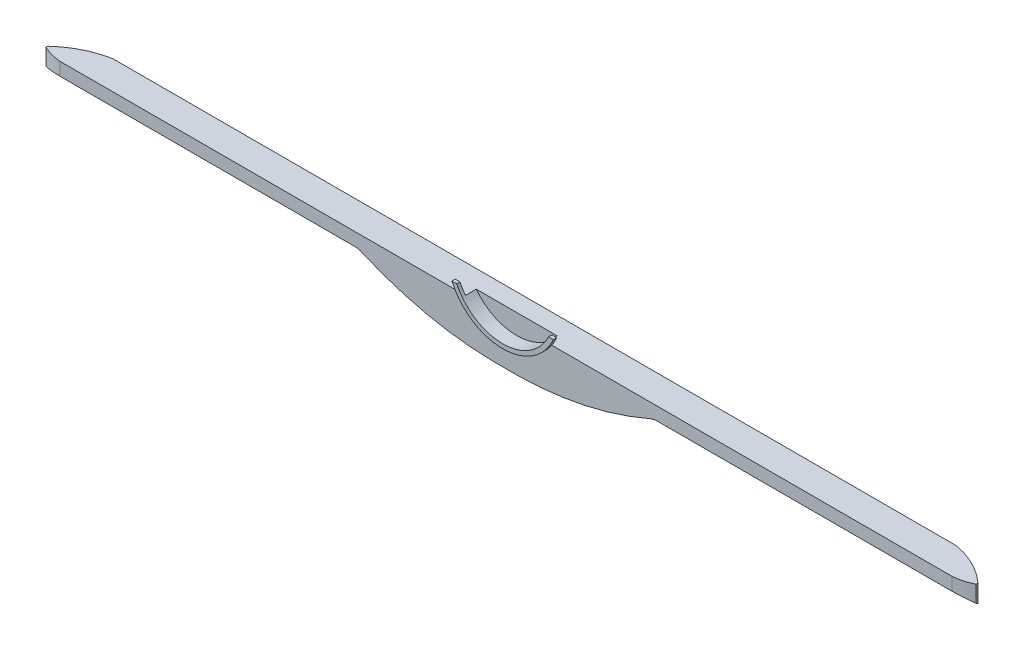
ISO-10303-21;
HEADER;
FILE_DESCRIPTION(('STEP AP214'),'2;1');
FILE_NAME('part.step','',(''),(''),'','','');
FILE_SCHEMA(('AUTOMOTIVE_DESIGN { 1 0 10303 214 1 1 1 1 }'));
ENDSEC;
DATA;
#1=APPLICATION_CONTEXT('core data for automotive mechanical design processes');
#2=APPLICATION_PROTOCOL_DEFINITION('international standard','automotive_design',2000,#1);
#3=PRODUCT_CONTEXT('',#1,'mechanical');
#4=PRODUCT('Part','Part','',(#3));
#5=PRODUCT_RELATED_PRODUCT_CATEGORY('part','',(#4));
#6=PRODUCT_DEFINITION_FORMATION('','',#4);
#7=PRODUCT_DEFINITION_CONTEXT('part definition',#1,'design');
#8=PRODUCT_DEFINITION('design','',#6,#7);
#9=PRODUCT_DEFINITION_SHAPE('','',#8);
#10=(LENGTH_UNIT() NAMED_UNIT(*) SI_UNIT(.MILLI.,.METRE.));
#11=(NAMED_UNIT(*) PLANE_ANGLE_UNIT() SI_UNIT($,.RADIAN.));
#12=(NAMED_UNIT(*) SI_UNIT($,.STERADIAN.) SOLID_ANGLE_UNIT());
#13=UNCERTAINTY_MEASURE_WITH_UNIT(LENGTH_MEASURE(1.E-05),#10,'distance_accuracy_value','');
#14=(GEOMETRIC_REPRESENTATION_CONTEXT(3) GLOBAL_UNCERTAINTY_ASSIGNED_CONTEXT((#13)) GLOBAL_UNIT_ASSIGNED_CONTEXT((#10,
#11,#12)) REPRESENTATION_CONTEXT('',''));
#15=CARTESIAN_POINT('',(0.,0.,0.));
#16=DIRECTION('',(0.,0.,1.));
#17=DIRECTION('',(1.,0.,0.));
#18=AXIS2_PLACEMENT_3D('',#15,#16,#17);
#19=CARTESIAN_POINT('',(0.,43.5677984931941,3.93521612422814));
#20=DIRECTION('',(0.,0.,1.));
#21=DIRECTION('',(1.,0.,0.));
#22=AXIS2_PLACEMENT_3D('',#19,#20,#21);
#23=PLANE('',#22);
#24=DIRECTION('',(1.,0.,0.));
#25=VECTOR('',#24,1.);
#26=CARTESIAN_POINT('',(26.9786256199849,30.6561762367186,3.93521612422814));
#27=LINE('',#26,#25);
#28=CARTESIAN_POINT('',(26.9786256199849,30.6561762367186,3.93521612422814));
#29=VERTEX_POINT('',#28);
#30=CARTESIAN_POINT('',(29.7697201090978,30.6561762367186,3.93521612422814));
#31=VERTEX_POINT('',#30);
#32=EDGE_CURVE('E156',#29,#31,#27,.T.);
#33=ORIENTED_EDGE('',*,*,#32,.F.);
#34=CARTESIAN_POINT('',(0.,43.5677984931941,3.93521612422814));
#35=DIRECTION('',(0.,0.,-1.));
#36=DIRECTION('',(-1.,0.,0.));
#37=AXIS2_PLACEMENT_3D('',#34,#35,#36);
#38=CIRCLE('',#37,29.9091328800622);
#39=CARTESIAN_POINT('',(-26.9786256199849,30.6561762367186,3.93521612422814));
#40=VERTEX_POINT('',#39);
#41=EDGE_CURVE('E166',#29,#40,#38,.T.);
#42=ORIENTED_EDGE('',*,*,#41,.T.);
#43=DIRECTION('',(1.,0.,0.));
#44=VECTOR('',#43,1.);
#45=CARTESIAN_POINT('',(-29.7697201090978,30.6561762367186,3.93521612422814));
#46=LINE('',#45,#44);
#47=CARTESIAN_POINT('',(-29.7697201090978,30.6561762367186,3.93521612422814));
#48=VERTEX_POINT('',#47);
#49=EDGE_CURVE('E161',#48,#40,#46,.T.);
#50=ORIENTED_EDGE('',*,*,#49,.F.);
#51=CARTESIAN_POINT('',(0.,43.5677984931941,3.93521612422814));
#52=DIRECTION('',(0.,0.,-1.));
#53=DIRECTION('',(-1.,0.,0.));
#54=AXIS2_PLACEMENT_3D('',#51,#52,#53);
#55=CIRCLE('',#54,32.4491328800622);
#56=EDGE_CURVE('E20',#31,#48,#55,.T.);
#57=ORIENTED_EDGE('',*,*,#56,.F.);
#58=EDGE_LOOP('',(#33,#42,#50,#57));
#59=FACE_BOUND('',#58,.T.);
#60=ADVANCED_FACE('F17',(#59),#23,.T.);
#61=CARTESIAN_POINT('',(26.9786256199849,30.6561762367186,3.93521612422814));
#62=DIRECTION('',(0.,1.,0.));
#63=DIRECTION('',(0.,0.,1.));
#64=AXIS2_PLACEMENT_3D('',#61,#62,#63);
#65=PLANE('',#64);
#66=ORIENTED_EDGE('',*,*,#32,.T.);
#67=DIRECTION('',(0.,0.,-1.));
#68=VECTOR('',#67,1.);
#69=CARTESIAN_POINT('',(29.7697201090978,30.6561762367186,3.93521612422814));
#70=LINE('',#69,#68);
#71=CARTESIAN_POINT('',(29.7697201090978,30.6561762367186,2.03021612422814));
#72=VERTEX_POINT('',#71);
#73=EDGE_CURVE('E169',#72,#31,#70,.F.);
#74=ORIENTED_EDGE('',*,*,#73,.F.);
#75=DIRECTION('',(1.,0.,0.));
#76=VECTOR('',#75,1.);
#77=CARTESIAN_POINT('',(0.,30.6561762367186,2.03021612422814));
#78=LINE('',#77,#76);
#79=CARTESIAN_POINT('',(26.9786256199849,30.6561762367186,2.03021612422814));
#80=VERTEX_POINT('',#79);
#81=EDGE_CURVE('E264',#72,#80,#78,.F.);
#82=ORIENTED_EDGE('',*,*,#81,.T.);
#83=DIRECTION('',(0.,0.,-1.));
#84=VECTOR('',#83,1.);
#85=CARTESIAN_POINT('',(26.9786256199849,30.6561762367186,3.93521612422814));
#86=LINE('',#85,#84);
#87=EDGE_CURVE('E184',#80,#29,#86,.F.);
#88=ORIENTED_EDGE('',*,*,#87,.T.);
#89=EDGE_LOOP('',(#66,#74,#82,#88));
#90=FACE_BOUND('',#89,.T.);
#91=ADVANCED_FACE('F404',(#90),#65,.T.);
#92=CARTESIAN_POINT('',(-29.7697201090978,30.6561762367186,3.93521612422814));
#93=DIRECTION('',(0.,1.,0.));
#94=DIRECTION('',(0.,0.,1.));
#95=AXIS2_PLACEMENT_3D('',#92,#93,#94);
#96=PLANE('',#95);
#97=ORIENTED_EDGE('',*,*,#49,.T.);
#98=DIRECTION('',(0.,0.,-1.));
#99=VECTOR('',#98,1.);
#100=CARTESIAN_POINT('',(-26.9786256199849,30.6561762367186,3.93521612422814));
#101=LINE('',#100,#99);
#102=CARTESIAN_POINT('',(-26.9786256199849,30.6561762367186,2.03021612422814));
#103=VERTEX_POINT('',#102);
#104=EDGE_CURVE('E267',#40,#103,#101,.T.);
#105=ORIENTED_EDGE('',*,*,#104,.T.);
#106=DIRECTION('',(1.,0.,0.));
#107=VECTOR('',#106,1.);
#108=CARTESIAN_POINT('',(0.,30.6561762367186,2.03021612422814));
#109=LINE('',#108,#107);
#110=CARTESIAN_POINT('',(-29.7697201090978,30.6561762367186,2.03021612422814));
#111=VERTEX_POINT('',#110);
#112=EDGE_CURVE('E175',#103,#111,#109,.F.);
#113=ORIENTED_EDGE('',*,*,#112,.T.);
#114=DIRECTION('',(0.,0.,-1.));
#115=VECTOR('',#114,1.);
#116=CARTESIAN_POINT('',(-29.7697201090978,30.6561762367186,3.93521612422814));
#117=LINE('',#116,#115);
#118=EDGE_CURVE('E172',#48,#111,#117,.T.);
#119=ORIENTED_EDGE('',*,*,#118,.F.);
#120=EDGE_LOOP('',(#97,#105,#113,#119));
#121=FACE_BOUND('',#120,.T.);
#122=ADVANCED_FACE('F173',(#121),#96,.T.);
#123=CARTESIAN_POINT('',(0.,43.5677984931941,3.93521612422814));
#124=DIRECTION('',(0.,0.,-1.));
#125=DIRECTION('',(-1.,0.,0.));
#126=AXIS2_PLACEMENT_3D('',#123,#124,#125);
#127=CYLINDRICAL_SURFACE('',#126,32.4491328800622);
#128=ORIENTED_EDGE('',*,*,#56,.T.);
#129=ORIENTED_EDGE('',*,*,#118,.T.);
#130=CARTESIAN_POINT('',(0.,43.5677984931941,2.03021612422814));
#131=DIRECTION('',(0.,0.,-1.));
#132=DIRECTION('',(-1.,0.,0.));
#133=AXIS2_PLACEMENT_3D('',#130,#131,#132);
#134=CIRCLE('',#133,32.4491328800622);
#135=CARTESIAN_POINT('',(-26.8863780115252,25.4,2.03021612422814));
#136=VERTEX_POINT('',#135);
#137=EDGE_CURVE('E255',#111,#136,#134,.F.);
#138=ORIENTED_EDGE('',*,*,#137,.T.);
#139=CARTESIAN_POINT('',(0.,43.5677984931941,2.03021612422814));
#140=DIRECTION('',(0.,0.,-1.));
#141=DIRECTION('',(-1.,0.,0.));
#142=AXIS2_PLACEMENT_3D('',#139,#140,#141);
#143=CIRCLE('',#142,32.4491328800622);
#144=CARTESIAN_POINT('',(26.8863780115252,25.4,2.03021612422814));
#145=VERTEX_POINT('',#144);
#146=EDGE_CURVE('E243',#136,#145,#143,.F.);
#147=ORIENTED_EDGE('',*,*,#146,.T.);
#148=CARTESIAN_POINT('',(0.,43.5677984931941,2.03021612422814));
#149=DIRECTION('',(0.,0.,-1.));
#150=DIRECTION('',(-1.,0.,0.));
#151=AXIS2_PLACEMENT_3D('',#148,#149,#150);
#152=CIRCLE('',#151,32.4491328800622);
#153=EDGE_CURVE('E265',#145,#72,#152,.F.);
#154=ORIENTED_EDGE('',*,*,#153,.T.);
#155=ORIENTED_EDGE('',*,*,#73,.T.);
#156=EDGE_LOOP('',(#128,#129,#138,#147,#154,#155));
#157=FACE_BOUND('',#156,.T.);
#158=ADVANCED_FACE('F180',(#157),#127,.T.);
#159=CARTESIAN_POINT('',(-88.9,7.34663165308634,9.27140559403347));
#160=DIRECTION('',(0.,-0.570172399197273,-0.821525066686115));
#161=DIRECTION('',(0.,0.821525066686115,-0.570172399197273));
#162=AXIS2_PLACEMENT_3D('',#159,#160,#161);
#163=CYLINDRICAL_SURFACE('',#162,12.7);
#164=CARTESIAN_POINT('',(-88.9,6.08756605075157,7.45729822163786));
#165=DIRECTION('',(-0.928883399168645,0.370372286691247,0.));
#166=DIRECTION('',(-0.200683743541891,-0.503309250064055,-0.840479526150383));
#167=AXIS2_PLACEMENT_3D('',#164,#165,#166);
#168=ELLIPSE('',#167,60.1393940332044,12.7);
#169=CARTESIAN_POINT('',(-88.9000000000002,6.08756605075219,-14.8166666666651));
#170=VERTEX_POINT('',#169);
#171=CARTESIAN_POINT('',(-84.6016667576282,16.8676663347188,2.03021612422814));
#172=VERTEX_POINT('',#171);
#173=EDGE_CURVE('E232',#170,#172,#168,.F.);
#174=ORIENTED_EDGE('',*,*,#173,.T.);
#175=CARTESIAN_POINT('',(-88.9,2.3209464482569,2.03021612422815));
#176=DIRECTION('',(0.,0.,-1.));
#177=DIRECTION('',(0.,-1.,0.));
#178=AXIS2_PLACEMENT_3D('',#175,#176,#177);
#179=ELLIPSE('',#178,15.4590535517431,12.7);
#180=CARTESIAN_POINT('',(-88.8999999999999,17.78,2.03021612422815));
#181=VERTEX_POINT('',#180);
#182=EDGE_CURVE('E246',#172,#181,#179,.F.);
#183=ORIENTED_EDGE('',*,*,#182,.T.);
#184=DIRECTION('',(0.,0.570172399197273,0.821525066686115));
#185=VECTOR('',#184,1.);
#186=CARTESIAN_POINT('',(-88.8999999999997,17.78,2.03021612422811));
#187=LINE('',#186,#185);
#188=EDGE_CURVE('E227',#181,#170,#187,.F.);
#189=ORIENTED_EDGE('',*,*,#188,.T.);
#190=EDGE_LOOP('',(#174,#183,#189));
#191=FACE_BOUND('',#190,.T.);
#192=ADVANCED_FACE('F318',(#191),#163,.F.);
#193=CARTESIAN_POINT('',(-273.05,25.4,-6.39322527121921));
#194=DIRECTION('',(-1.,0.,0.));
#195=DIRECTION('',(0.,0.,1.));
#196=AXIS2_PLACEMENT_3D('',#193,#194,#195);
#197=PLANE('',#196);
#198=DIRECTION('',(0.,0.,1.));
#199=VECTOR('',#198,1.);
#200=CARTESIAN_POINT('',(-273.05,25.4,-6.39322527121921));
#201=LINE('',#200,#199);
#202=CARTESIAN_POINT('',(-273.05,25.4,-0.973666666666666));
#203=VERTEX_POINT('',#202);
#204=CARTESIAN_POINT('',(-273.05,25.4,-2.11666666666667));
#205=VERTEX_POINT('',#204);
#206=EDGE_CURVE('E178',#203,#205,#201,.F.);
#207=ORIENTED_EDGE('',*,*,#206,.T.);
#208=DIRECTION('',(0.,-1.,0.));
#209=VECTOR('',#208,1.);
#210=CARTESIAN_POINT('',(-273.05,25.4,-2.11666666666667));
#211=LINE('',#210,#209);
#212=CARTESIAN_POINT('',(-273.05,14.9018917036675,-2.11666666666677));
#213=VERTEX_POINT('',#212);
#214=EDGE_CURVE('E226',#213,#205,#211,.F.);
#215=ORIENTED_EDGE('',*,*,#214,.F.);
#216=DIRECTION('',(0.,0.570172399197273,0.821525066686115));
#217=VECTOR('',#216,1.);
#218=CARTESIAN_POINT('',(-273.05,17.78,2.03021612422811));
#219=LINE('',#218,#217);
#220=CARTESIAN_POINT('',(-273.05,15.6951810124301,-0.973666666666617));
#221=VERTEX_POINT('',#220);
#222=EDGE_CURVE('E231',#213,#221,#219,.T.);
#223=ORIENTED_EDGE('',*,*,#222,.T.);
#224=DIRECTION('',(0.,-1.,0.));
#225=VECTOR('',#224,1.);
#226=CARTESIAN_POINT('',(-273.05,25.4,-0.973666666666664));
#227=LINE('',#226,#225);
#228=EDGE_CURVE('E261',#203,#221,#227,.T.);
#229=ORIENTED_EDGE('',*,*,#228,.F.);
#230=EDGE_LOOP('',(#207,#215,#223,#229));
#231=FACE_BOUND('',#230,.T.);
#232=ADVANCED_FACE('F309',(#231),#197,.T.);
#233=CARTESIAN_POINT('',(0.,-395.337646810208,-4.31978387577186));
#234=DIRECTION('',(0.,0.,1.));
#235=DIRECTION('',(1.,0.,0.));
#236=AXIS2_PLACEMENT_3D('',#233,#234,#235);
#237=PLANE('',#236);
#238=DIRECTION('',(1.,0.,0.));
#239=VECTOR('',#238,1.);
#240=CARTESIAN_POINT('',(-425.109610298846,25.4,-4.31978387577186));
#241=LINE('',#240,#239);
#242=CARTESIAN_POINT('',(-23.7589420544752,25.4,-4.31978387577186));
#243=VERTEX_POINT('',#242);
#244=CARTESIAN_POINT('',(23.7589420544752,25.4,-4.31978387577186));
#245=VERTEX_POINT('',#244);
#246=EDGE_CURVE('E278',#243,#245,#241,.T.);
#247=ORIENTED_EDGE('',*,*,#246,.F.);
#248=CARTESIAN_POINT('',(0.,43.5677984931941,-4.31978387577186));
#249=DIRECTION('',(0.,0.,-1.));
#250=DIRECTION('',(-1.,0.,0.));
#251=AXIS2_PLACEMENT_3D('',#248,#249,#250);
#252=CIRCLE('',#251,29.9091328800622);
#253=EDGE_CURVE('E268',#243,#245,#252,.F.);
#254=ORIENTED_EDGE('',*,*,#253,.T.);
#255=EDGE_LOOP('',(#247,#254));
#256=FACE_BOUND('',#255,.T.);
#257=ADVANCED_FACE('F307',(#256),#237,.T.);
#258=CARTESIAN_POINT('',(0.,43.5677984931941,3.93521612422814));
#259=DIRECTION('',(0.,0.,-1.));
#260=DIRECTION('',(-1.,0.,0.));
#261=AXIS2_PLACEMENT_3D('',#258,#259,#260);
#262=CYLINDRICAL_SURFACE('',#261,29.9091328800622);
#263=ORIENTED_EDGE('',*,*,#104,.F.);
#264=ORIENTED_EDGE('',*,*,#41,.F.);
#265=ORIENTED_EDGE('',*,*,#87,.F.);
#266=CARTESIAN_POINT('',(0.,43.5677984931941,2.03021612422814));
#267=DIRECTION('',(0.,0.,-1.));
#268=DIRECTION('',(-1.,0.,0.));
#269=AXIS2_PLACEMENT_3D('',#266,#267,#268);
#270=CIRCLE('',#269,29.9091328800622);
#271=CARTESIAN_POINT('',(23.7589420544752,25.4,2.03021612422814));
#272=VERTEX_POINT('',#271);
#273=EDGE_CURVE('E262',#80,#272,#270,.T.);
#274=ORIENTED_EDGE('',*,*,#273,.T.);
#275=DIRECTION('',(0.,0.,1.));
#276=VECTOR('',#275,1.);
#277=CARTESIAN_POINT('',(23.7589420544752,25.4,-6.39322527121921));
#278=LINE('',#277,#276);
#279=EDGE_CURVE('E301',#245,#272,#278,.T.);
#280=ORIENTED_EDGE('',*,*,#279,.F.);
#281=ORIENTED_EDGE('',*,*,#253,.F.);
#282=DIRECTION('',(0.,0.,1.));
#283=VECTOR('',#282,1.);
#284=CARTESIAN_POINT('',(-23.7589420544752,25.4,-6.39322527121921));
#285=LINE('',#284,#283);
#286=CARTESIAN_POINT('',(-23.7589420544752,25.4,2.03021612422814));
#287=VERTEX_POINT('',#286);
#288=EDGE_CURVE('E284',#287,#243,#285,.F.);
#289=ORIENTED_EDGE('',*,*,#288,.F.);
#290=CARTESIAN_POINT('',(0.,43.5677984931941,2.03021612422814));
#291=DIRECTION('',(0.,0.,-1.));
#292=DIRECTION('',(-1.,0.,0.));
#293=AXIS2_PLACEMENT_3D('',#290,#291,#292);
#294=CIRCLE('',#293,29.9091328800622);
#295=EDGE_CURVE('E258',#287,#103,#294,.T.);
#296=ORIENTED_EDGE('',*,*,#295,.T.);
#297=EDGE_LOOP('',(#263,#264,#265,#274,#280,#281,#289,#296));
#298=FACE_BOUND('',#297,.T.);
#299=ADVANCED_FACE('F282',(#298),#262,.F.);
#300=CARTESIAN_POINT('',(0.,43.5677984931941,2.03021612422814));
#301=DIRECTION('',(0.,0.,1.));
#302=DIRECTION('',(1.,0.,0.));
#303=AXIS2_PLACEMENT_3D('',#300,#301,#302);
#304=PLANE('',#303);
#305=ORIENTED_EDGE('',*,*,#273,.F.);
#306=ORIENTED_EDGE('',*,*,#81,.F.);
#307=ORIENTED_EDGE('',*,*,#153,.F.);
#308=DIRECTION('',(1.,0.,0.));
#309=VECTOR('',#308,1.);
#310=CARTESIAN_POINT('',(-425.109610298846,25.4,2.03021612422814));
#311=LINE('',#310,#309);
#312=EDGE_CURVE('E298',#272,#145,#311,.T.);
#313=ORIENTED_EDGE('',*,*,#312,.F.);
#314=EDGE_LOOP('',(#305,#306,#307,#313));
#315=FACE_BOUND('',#314,.T.);
#316=ADVANCED_FACE('F316',(#315),#304,.F.);
#317=CARTESIAN_POINT('',(-259.353959890382,25.4,-29.6177059299364));
#318=DIRECTION('',(0.,-1.,0.));
#319=DIRECTION('',(0.,0.,-1.));
#320=AXIS2_PLACEMENT_3D('',#317,#318,#319);
#321=CYLINDRICAL_SURFACE('',#320,31.75);
#322=DIRECTION('',(0.,1.,0.));
#323=VECTOR('',#322,1.);
#324=CARTESIAN_POINT('',(-261.897880025434,25.4,2.03021612422817));
#325=LINE('',#324,#323);
#326=CARTESIAN_POINT('',(-261.897880025434,17.78,2.03021612422812));
#327=VERTEX_POINT('',#326);
#328=CARTESIAN_POINT('',(-261.897880025434,25.4,2.03021612422817));
#329=VERTEX_POINT('',#328);
#330=EDGE_CURVE('E245',#327,#329,#325,.T.);
#331=ORIENTED_EDGE('',*,*,#330,.T.);
#332=CARTESIAN_POINT('',(-259.353959890382,25.4,-29.6177059299364));
#333=DIRECTION('',(0.,-1.,0.));
#334=DIRECTION('',(0.,0.,-1.));
#335=AXIS2_PLACEMENT_3D('',#332,#333,#334);
#336=CIRCLE('',#335,31.75);
#337=EDGE_CURVE('E211',#203,#329,#336,.F.);
#338=ORIENTED_EDGE('',*,*,#337,.F.);
#339=ORIENTED_EDGE('',*,*,#228,.T.);
#340=CARTESIAN_POINT('',(-259.353959890382,-4.18496781287591,-29.6177059299364));
#341=DIRECTION('',(0.,0.821525066686115,-0.570172399197273));
#342=DIRECTION('',(0.,-0.570172399197273,-0.821525066686115));
#343=AXIS2_PLACEMENT_3D('',#340,#341,#342);
#344=ELLIPSE('',#343,38.6476338793578,31.75);
#345=EDGE_CURVE('E228',#221,#327,#344,.T.);
#346=ORIENTED_EDGE('',*,*,#345,.T.);
#347=EDGE_LOOP('',(#331,#338,#339,#346));
#348=FACE_BOUND('',#347,.T.);
#349=ADVANCED_FACE('F391',(#348),#321,.T.);
#350=CARTESIAN_POINT('',(0.,43.5677984931941,2.03021612422814));
#351=DIRECTION('',(0.,0.,1.));
#352=DIRECTION('',(1.,0.,0.));
#353=AXIS2_PLACEMENT_3D('',#350,#351,#352);
#354=PLANE('',#353);
#355=ORIENTED_EDGE('',*,*,#137,.F.);
#356=ORIENTED_EDGE('',*,*,#112,.F.);
#357=ORIENTED_EDGE('',*,*,#295,.F.);
#358=DIRECTION('',(1.,0.,0.));
#359=VECTOR('',#358,1.);
#360=CARTESIAN_POINT('',(-425.109610298846,25.4,2.03021612422814));
#361=LINE('',#360,#359);
#362=EDGE_CURVE('E210',#136,#287,#361,.T.);
#363=ORIENTED_EDGE('',*,*,#362,.F.);
#364=EDGE_LOOP('',(#355,#356,#357,#363));
#365=FACE_BOUND('',#364,.T.);
#366=ADVANCED_FACE('F288',(#365),#354,.F.);
#367=CARTESIAN_POINT('',(273.05,25.4,-6.39322527121921));
#368=DIRECTION('',(-1.,0.,0.));
#369=DIRECTION('',(0.,0.,1.));
#370=AXIS2_PLACEMENT_3D('',#367,#368,#369);
#371=PLANE('',#370);
#372=DIRECTION('',(0.,-1.,0.));
#373=VECTOR('',#372,1.);
#374=CARTESIAN_POINT('',(273.05,25.4,-2.11666666666675));
#375=LINE('',#374,#373);
#376=CARTESIAN_POINT('',(273.05,25.4,-2.11666666666679));
#377=VERTEX_POINT('',#376);
#378=CARTESIAN_POINT('',(273.05,14.9018917036675,-2.1166666666668));
#379=VERTEX_POINT('',#378);
#380=EDGE_CURVE('E209',#377,#379,#375,.T.);
#381=ORIENTED_EDGE('',*,*,#380,.F.);
#382=DIRECTION('',(0.,0.,1.));
#383=VECTOR('',#382,1.);
#384=CARTESIAN_POINT('',(273.05,25.4,-6.39322527121921));
#385=LINE('',#384,#383);
#386=CARTESIAN_POINT('',(273.05,25.4,-0.973666666666697));
#387=VERTEX_POINT('',#386);
#388=EDGE_CURVE('E218',#387,#377,#385,.F.);
#389=ORIENTED_EDGE('',*,*,#388,.F.);
#390=DIRECTION('',(0.,-1.,0.));
#391=VECTOR('',#390,1.);
#392=CARTESIAN_POINT('',(273.05,25.4,-0.973666666666699));
#393=LINE('',#392,#391);
#394=CARTESIAN_POINT('',(273.05,15.69518101243,-0.973666666666694));
#395=VERTEX_POINT('',#394);
#396=EDGE_CURVE('E254',#395,#387,#393,.F.);
#397=ORIENTED_EDGE('',*,*,#396,.F.);
#398=DIRECTION('',(0.,0.570172399197275,0.821525066686113));
#399=VECTOR('',#398,1.);
#400=CARTESIAN_POINT('',(273.05,14.9018917036676,-2.11666666666667));
#401=LINE('',#400,#399);
#402=EDGE_CURVE('E257',#379,#395,#401,.T.);
#403=ORIENTED_EDGE('',*,*,#402,.F.);
#404=EDGE_LOOP('',(#381,#389,#397,#403));
#405=FACE_BOUND('',#404,.T.);
#406=ADVANCED_FACE('F384',(#405),#371,.F.);
#407=CARTESIAN_POINT('',(88.9,1.56641473082901,0.943059467137366));
#408=DIRECTION('',(0.,0.570172399197273,0.821525066686115));
#409=DIRECTION('',(0.,-0.821525066686115,0.570172399197273));
#410=AXIS2_PLACEMENT_3D('',#407,#408,#409);
#411=CYLINDRICAL_SURFACE('',#410,12.7);
#412=DIRECTION('',(0.,-0.570172399197273,-0.821525066686115));
#413=VECTOR('',#412,1.);
#414=CARTESIAN_POINT('',(88.8999999999997,17.78,2.03021612422811));
#415=LINE('',#414,#413);
#416=CARTESIAN_POINT('',(88.8999999999998,17.78,2.03021612422812));
#417=VERTEX_POINT('',#416);
#418=CARTESIAN_POINT('',(88.8999999999997,6.0875660507516,-14.8166666666659));
#419=VERTEX_POINT('',#418);
#420=EDGE_CURVE('E205',#417,#419,#415,.T.);
#421=ORIENTED_EDGE('',*,*,#420,.F.);
#422=CARTESIAN_POINT('',(88.9,2.32094644825689,2.03021612422813));
#423=DIRECTION('',(0.,0.,-1.));
#424=DIRECTION('',(0.,1.,0.));
#425=AXIS2_PLACEMENT_3D('',#422,#423,#424);
#426=ELLIPSE('',#425,15.4590535517431,12.7);
#427=CARTESIAN_POINT('',(84.6016667576282,16.8676663347185,2.03021612422813));
#428=VERTEX_POINT('',#427);
#429=EDGE_CURVE('E248',#417,#428,#426,.F.);
#430=ORIENTED_EDGE('',*,*,#429,.T.);
#431=CARTESIAN_POINT('',(88.9,6.08756605075151,7.45729822163778));
#432=DIRECTION('',(-0.928883399168645,-0.370372286691247,0.));
#433=DIRECTION('',(-0.200683743541891,0.503309250064055,0.840479526150383));
#434=AXIS2_PLACEMENT_3D('',#431,#432,#433);
#435=ELLIPSE('',#434,60.1393940332044,12.7);
#436=EDGE_CURVE('E251',#419,#428,#435,.F.);
#437=ORIENTED_EDGE('',*,*,#436,.F.);
#438=EDGE_LOOP('',(#421,#430,#437));
#439=FACE_BOUND('',#438,.T.);
#440=ADVANCED_FACE('F380',(#439),#411,.F.);
#441=CARTESIAN_POINT('',(259.353959890382,25.4,-29.6177059299364));
#442=DIRECTION('',(0.,-1.,0.));
#443=DIRECTION('',(0.,0.,-1.));
#444=AXIS2_PLACEMENT_3D('',#441,#442,#443);
#445=CYLINDRICAL_SURFACE('',#444,31.75);
#446=ORIENTED_EDGE('',*,*,#396,.T.);
#447=CARTESIAN_POINT('',(259.353959890382,25.4,-29.6177059299364));
#448=DIRECTION('',(0.,-1.,0.));
#449=DIRECTION('',(0.,0.,-1.));
#450=AXIS2_PLACEMENT_3D('',#447,#448,#449);
#451=CIRCLE('',#450,31.75);
#452=CARTESIAN_POINT('',(261.897880025434,25.4,2.03021612422813));
#453=VERTEX_POINT('',#452);
#454=EDGE_CURVE('E219',#453,#387,#451,.F.);
#455=ORIENTED_EDGE('',*,*,#454,.F.);
#456=DIRECTION('',(0.,1.,0.));
#457=VECTOR('',#456,1.);
#458=CARTESIAN_POINT('',(261.897880025434,25.4,2.03021612422811));
#459=LINE('',#458,#457);
#460=CARTESIAN_POINT('',(261.897880025434,17.78,2.03021612422811));
#461=VERTEX_POINT('',#460);
#462=EDGE_CURVE('E250',#453,#461,#459,.F.);
#463=ORIENTED_EDGE('',*,*,#462,.T.);
#464=CARTESIAN_POINT('',(259.353959890382,-4.18496781287591,-29.6177059299364));
#465=DIRECTION('',(0.,-0.821525066686115,0.570172399197273));
#466=DIRECTION('',(0.,-0.570172399197273,-0.821525066686115));
#467=AXIS2_PLACEMENT_3D('',#464,#465,#466);
#468=ELLIPSE('',#467,38.6476338793578,31.75);
#469=EDGE_CURVE('E199',#395,#461,#468,.T.);
#470=ORIENTED_EDGE('',*,*,#469,.F.);
#471=EDGE_LOOP('',(#446,#455,#463,#470));
#472=FACE_BOUND('',#471,.T.);
#473=ADVANCED_FACE('F376',(#472),#445,.T.);
#474=CARTESIAN_POINT('',(214.808473658181,-309.687385797208,-125.64984924627));
#475=DIRECTION('',(-0.928883399168645,-0.370372286691247,0.));
#476=DIRECTION('',(0.370372286691247,-0.928883399168645,0.));
#477=AXIS2_PLACEMENT_3D('',#474,#475,#476);
#478=PLANE('',#477);
#479=DIRECTION('',(0.,0.,1.));
#480=VECTOR('',#479,1.);
#481=CARTESIAN_POINT('',(84.6016667576282,16.8676663347185,-125.64984924627));
#482=LINE('',#481,#480);
#483=CARTESIAN_POINT('',(84.6016667576281,16.8676663347185,0.715692698917419));
#484=VERTEX_POINT('',#483);
#485=EDGE_CURVE('E242',#484,#428,#482,.T.);
#486=ORIENTED_EDGE('',*,*,#485,.F.);
#487=DIRECTION('',(-0.221687176685992,0.555985276522192,0.801083745923942));
#488=VECTOR('',#487,1.);
#489=CARTESIAN_POINT('',(88.8999999999997,6.08756605075109,-14.8166666666667));
#490=LINE('',#489,#488);
#491=EDGE_CURVE('E198',#419,#484,#490,.T.);
#492=ORIENTED_EDGE('',*,*,#491,.F.);
#493=ORIENTED_EDGE('',*,*,#436,.T.);
#494=EDGE_LOOP('',(#486,#492,#493));
#495=FACE_BOUND('',#494,.T.);
#496=ADVANCED_FACE('F372',(#495),#478,.T.);
#497=CARTESIAN_POINT('',(-425.109610298846,25.4,2.03021612422819));
#498=DIRECTION('',(0.,0.,-1.));
#499=DIRECTION('',(-1.,0.,0.));
#500=AXIS2_PLACEMENT_3D('',#497,#498,#499);
#501=PLANE('',#500);
#502=DIRECTION('',(1.,0.,0.));
#503=VECTOR('',#502,1.);
#504=CARTESIAN_POINT('',(-425.109610298846,25.4,2.03021612422817));
#505=LINE('',#504,#503);
#506=EDGE_CURVE('E214',#329,#136,#505,.T.);
#507=ORIENTED_EDGE('',*,*,#506,.F.);
#508=ORIENTED_EDGE('',*,*,#330,.F.);
#509=DIRECTION('',(1.,0.,0.));
#510=VECTOR('',#509,1.);
#511=CARTESIAN_POINT('',(-685.8,17.78,2.03021612422811));
#512=LINE('',#511,#510);
#513=EDGE_CURVE('E230',#327,#181,#512,.T.);
#514=ORIENTED_EDGE('',*,*,#513,.T.);
#515=ORIENTED_EDGE('',*,*,#182,.F.);
#516=CARTESIAN_POINT('',(-3.8424371109079,201.326220325461,2.03021612422813));
#517=DIRECTION('',(0.,0.,1.));
#518=DIRECTION('',(1.,0.,0.));
#519=AXIS2_PLACEMENT_3D('',#516,#517,#518);
#520=CIRCLE('',#519,201.362884647314);
#521=CARTESIAN_POINT('',(-7.68487422181354,0.,2.03021612422813));
#522=VERTEX_POINT('',#521);
#523=EDGE_CURVE('E236',#522,#172,#520,.F.);
#524=ORIENTED_EDGE('',*,*,#523,.F.);
#525=DIRECTION('',(1.,0.,0.));
#526=VECTOR('',#525,1.);
#527=CARTESIAN_POINT('',(-304.8,0.,2.03021612422814));
#528=LINE('',#527,#526);
#529=CARTESIAN_POINT('',(7.68487422181348,0.,2.03021612422813));
#530=VERTEX_POINT('',#529);
#531=EDGE_CURVE('E192',#522,#530,#528,.T.);
#532=ORIENTED_EDGE('',*,*,#531,.T.);
#533=CARTESIAN_POINT('',(3.8424371109079,201.326220325461,2.03021612422813));
#534=DIRECTION('',(0.,0.,1.));
#535=DIRECTION('',(1.,0.,0.));
#536=AXIS2_PLACEMENT_3D('',#533,#534,#535);
#537=CIRCLE('',#536,201.362884647314);
#538=EDGE_CURVE('E239',#428,#530,#537,.F.);
#539=ORIENTED_EDGE('',*,*,#538,.F.);
#540=ORIENTED_EDGE('',*,*,#429,.F.);
#541=DIRECTION('',(1.,0.,0.));
#542=VECTOR('',#541,1.);
#543=CARTESIAN_POINT('',(685.8,17.78,2.03021612422811));
#544=LINE('',#543,#542);
#545=EDGE_CURVE('E430',#461,#417,#544,.F.);
#546=ORIENTED_EDGE('',*,*,#545,.F.);
#547=ORIENTED_EDGE('',*,*,#462,.F.);
#548=DIRECTION('',(1.,0.,0.));
#549=VECTOR('',#548,1.);
#550=CARTESIAN_POINT('',(-425.109610298846,25.4,2.03021612422814));
#551=LINE('',#550,#549);
#552=EDGE_CURVE('E222',#145,#453,#551,.T.);
#553=ORIENTED_EDGE('',*,*,#552,.F.);
#554=ORIENTED_EDGE('',*,*,#146,.F.);
#555=EDGE_LOOP('',(#507,#508,#514,#515,#524,#532,#539,#540,#546,#547,#553,#554));
#556=FACE_BOUND('',#555,.T.);
#557=ADVANCED_FACE('F368',(#556),#501,.F.);
#558=CARTESIAN_POINT('',(3.8424371109079,201.326220325461,-125.64984924627));
#559=DIRECTION('',(0.,0.,1.));
#560=DIRECTION('',(1.,0.,0.));
#561=AXIS2_PLACEMENT_3D('',#558,#559,#560);
#562=CYLINDRICAL_SURFACE('',#561,201.362884647314);
#563=ORIENTED_EDGE('',*,*,#538,.T.);
#564=CARTESIAN_POINT('',(3.8424371109079,201.326220325461,-555.125009507932));
#565=DIRECTION('',(0.,0.940483088907541,0.339840491229238));
#566=DIRECTION('',(0.,-0.339840491229238,0.940483088907542));
#567=AXIS2_PLACEMENT_3D('',#564,#565,#566);
#568=ELLIPSE('',#567,592.521756071396,201.362884647314);
#569=CARTESIAN_POINT('',(53.1260975927312,6.08756605075109,-14.8166666666667));
#570=VERTEX_POINT('',#569);
#571=EDGE_CURVE('E190',#530,#570,#568,.T.);
#572=ORIENTED_EDGE('',*,*,#571,.T.);
#573=CARTESIAN_POINT('',(3.8424371109079,201.326220325461,266.490265584967));
#574=DIRECTION('',(0.,-0.821525066686115,0.570172399197273));
#575=DIRECTION('',(0.,0.570172399197273,0.821525066686115));
#576=AXIS2_PLACEMENT_3D('',#573,#574,#575);
#577=ELLIPSE('',#576,353.161403341877,201.362884647314);
#578=EDGE_CURVE('E195',#484,#570,#577,.F.);
#579=ORIENTED_EDGE('',*,*,#578,.F.);
#580=ORIENTED_EDGE('',*,*,#485,.T.);
#581=EDGE_LOOP('',(#563,#572,#579,#580));
#582=FACE_BOUND('',#581,.T.);
#583=ADVANCED_FACE('F365',(#582),#562,.T.);
#584=CARTESIAN_POINT('',(-3.8424371109079,201.326220325461,-125.64984924627));
#585=DIRECTION('',(0.,0.,1.));
#586=DIRECTION('',(1.,0.,0.));
#587=AXIS2_PLACEMENT_3D('',#584,#585,#586);
#588=CYLINDRICAL_SURFACE('',#587,201.362884647314);
#589=DIRECTION('',(0.,0.,1.));
#590=VECTOR('',#589,1.);
#591=CARTESIAN_POINT('',(-84.6016667576283,16.8676663347186,-125.64984924627));
#592=LINE('',#591,#590);
#593=CARTESIAN_POINT('',(-84.6016667576285,16.8676663347186,0.715692698917684));
#594=VERTEX_POINT('',#593);
#595=EDGE_CURVE('E235',#172,#594,#592,.F.);
#596=ORIENTED_EDGE('',*,*,#595,.T.);
#597=CARTESIAN_POINT('',(-3.8424371109079,201.326220325461,266.490265584967));
#598=DIRECTION('',(0.,-0.821525066686115,0.570172399197273));
#599=DIRECTION('',(0.,0.570172399197273,0.821525066686115));
#600=AXIS2_PLACEMENT_3D('',#597,#598,#599);
#601=ELLIPSE('',#600,353.161403341877,201.362884647314);
#602=CARTESIAN_POINT('',(-53.1260975927313,6.08756605075109,-14.8166666666667));
#603=VERTEX_POINT('',#602);
#604=EDGE_CURVE('E35',#603,#594,#601,.F.);
#605=ORIENTED_EDGE('',*,*,#604,.F.);
#606=CARTESIAN_POINT('',(-3.8424371109079,201.326220325461,-555.125009507932));
#607=DIRECTION('',(0.,0.940483088907541,0.339840491229238));
#608=DIRECTION('',(0.,-0.339840491229238,0.940483088907542));
#609=AXIS2_PLACEMENT_3D('',#606,#607,#608);
#610=ELLIPSE('',#609,592.521756071396,201.362884647314);
#611=EDGE_CURVE('E193',#603,#522,#610,.T.);
#612=ORIENTED_EDGE('',*,*,#611,.T.);
#613=ORIENTED_EDGE('',*,*,#523,.T.);
#614=EDGE_LOOP('',(#596,#605,#612,#613));
#615=FACE_BOUND('',#614,.T.);
#616=ADVANCED_FACE('F361',(#615),#588,.T.);
#617=CARTESIAN_POINT('',(-214.808473658181,-309.687385797208,-125.64984924627));
#618=DIRECTION('',(-0.928883399168645,0.370372286691247,0.));
#619=DIRECTION('',(-0.370372286691247,-0.928883399168645,0.));
#620=AXIS2_PLACEMENT_3D('',#617,#618,#619);
#621=PLANE('',#620);
#622=ORIENTED_EDGE('',*,*,#595,.F.);
#623=ORIENTED_EDGE('',*,*,#173,.F.);
#624=DIRECTION('',(-0.221687176686,-0.555985276522192,-0.801083745923941));
#625=VECTOR('',#624,1.);
#626=CARTESIAN_POINT('',(-84.6016667576287,16.8676663347186,0.715692698917566));
#627=LINE('',#626,#625);
#628=EDGE_CURVE('E189',#594,#170,#627,.T.);
#629=ORIENTED_EDGE('',*,*,#628,.F.);
#630=EDGE_LOOP('',(#622,#623,#629));
#631=FACE_BOUND('',#630,.T.);
#632=ADVANCED_FACE('F357',(#631),#621,.F.);
#633=CARTESIAN_POINT('',(-685.8,17.78,2.03021612422811));
#634=DIRECTION('',(0.,0.821525066686115,-0.570172399197273));
#635=DIRECTION('',(0.,0.570172399197273,0.821525066686115));
#636=AXIS2_PLACEMENT_3D('',#633,#634,#635);
#637=PLANE('',#636);
#638=ORIENTED_EDGE('',*,*,#188,.F.);
#639=ORIENTED_EDGE('',*,*,#513,.F.);
#640=ORIENTED_EDGE('',*,*,#345,.F.);
#641=ORIENTED_EDGE('',*,*,#222,.F.);
#642=CARTESIAN_POINT('',(-238.537033672607,40.7729318166972,35.1592659881202));
#643=DIRECTION('',(0.,0.821525066686115,-0.570172399197273));
#644=DIRECTION('',(0.,-0.570172399197273,-0.821525066686115));
#645=AXIS2_PLACEMENT_3D('',#642,#643,#644);
#646=ELLIPSE('',#645,61.8362142069725,50.8);
#647=CARTESIAN_POINT('',(-247.65,6.08756605075108,-14.8166666666667));
#648=VERTEX_POINT('',#647);
#649=EDGE_CURVE('E223',#648,#213,#646,.T.);
#650=ORIENTED_EDGE('',*,*,#649,.F.);
#651=DIRECTION('',(-1.,0.,0.));
#652=VECTOR('',#651,1.);
#653=CARTESIAN_POINT('',(-425.109610298846,6.08756605075107,-14.8166666666667));
#654=LINE('',#653,#652);
#655=EDGE_CURVE('E419',#170,#648,#654,.T.);
#656=ORIENTED_EDGE('',*,*,#655,.F.);
#657=EDGE_LOOP('',(#638,#639,#640,#641,#650,#656));
#658=FACE_BOUND('',#657,.T.);
#659=ADVANCED_FACE('F353',(#658),#637,.F.);
#660=CARTESIAN_POINT('',(-238.537033672607,25.4,35.1592659881202));
#661=DIRECTION('',(0.,-1.,0.));
#662=DIRECTION('',(0.,0.,-1.));
#663=AXIS2_PLACEMENT_3D('',#660,#661,#662);
#664=CYLINDRICAL_SURFACE('',#663,50.8);
#665=CARTESIAN_POINT('',(-238.537033672607,25.4,35.1592659881202));
#666=DIRECTION('',(0.,-1.,0.));
#667=DIRECTION('',(0.,0.,-1.));
#668=AXIS2_PLACEMENT_3D('',#665,#666,#667);
#669=CIRCLE('',#668,50.8);
#670=CARTESIAN_POINT('',(-247.65,25.4,-14.8166666666667));
#671=VERTEX_POINT('',#670);
#672=EDGE_CURVE('E215',#671,#205,#669,.F.);
#673=ORIENTED_EDGE('',*,*,#672,.F.);
#674=DIRECTION('',(0.,1.,0.));
#675=VECTOR('',#674,1.);
#676=CARTESIAN_POINT('',(-247.65,25.4,-14.8166666666667));
#677=LINE('',#676,#675);
#678=EDGE_CURVE('E415',#648,#671,#677,.T.);
#679=ORIENTED_EDGE('',*,*,#678,.F.);
#680=ORIENTED_EDGE('',*,*,#649,.T.);
#681=ORIENTED_EDGE('',*,*,#214,.T.);
#682=EDGE_LOOP('',(#673,#679,#680,#681));
#683=FACE_BOUND('',#682,.T.);
#684=ADVANCED_FACE('F350',(#683),#664,.T.);
#685=CARTESIAN_POINT('',(-425.109610298846,25.4,-6.39322527121921));
#686=DIRECTION('',(0.,1.,0.));
#687=DIRECTION('',(0.,0.,1.));
#688=AXIS2_PLACEMENT_3D('',#685,#686,#687);
#689=PLANE('',#688);
#690=ORIENTED_EDGE('',*,*,#506,.T.);
#691=ORIENTED_EDGE('',*,*,#362,.T.);
#692=ORIENTED_EDGE('',*,*,#288,.T.);
#693=ORIENTED_EDGE('',*,*,#246,.T.);
#694=ORIENTED_EDGE('',*,*,#279,.T.);
#695=ORIENTED_EDGE('',*,*,#312,.T.);
#696=ORIENTED_EDGE('',*,*,#552,.T.);
#697=ORIENTED_EDGE('',*,*,#454,.T.);
#698=ORIENTED_EDGE('',*,*,#388,.T.);
#699=CARTESIAN_POINT('',(238.537033672607,25.4,35.1592659881202));
#700=DIRECTION('',(0.,-1.,0.));
#701=DIRECTION('',(0.,0.,-1.));
#702=AXIS2_PLACEMENT_3D('',#699,#700,#701);
#703=CIRCLE('',#702,50.7999999999999);
#704=CARTESIAN_POINT('',(247.65,25.4,-14.8166666666667));
#705=VERTEX_POINT('',#704);
#706=EDGE_CURVE('E206',#705,#377,#703,.T.);
#707=ORIENTED_EDGE('',*,*,#706,.F.);
#708=DIRECTION('',(-1.,0.,0.));
#709=VECTOR('',#708,1.);
#710=CARTESIAN_POINT('',(-425.109610298846,25.4,-14.8166666666667));
#711=LINE('',#710,#709);
#712=EDGE_CURVE('E418',#671,#705,#711,.F.);
#713=ORIENTED_EDGE('',*,*,#712,.F.);
#714=ORIENTED_EDGE('',*,*,#672,.T.);
#715=ORIENTED_EDGE('',*,*,#206,.F.);
#716=ORIENTED_EDGE('',*,*,#337,.T.);
#717=EDGE_LOOP('',(#690,#691,#692,#693,#694,#695,#696,#697,#698,#707,#713,#714,#715,#716));
#718=FACE_BOUND('',#717,.T.);
#719=ADVANCED_FACE('F306',(#718),#689,.T.);
#720=CARTESIAN_POINT('',(238.537033672607,25.4,35.1592659881202));
#721=DIRECTION('',(0.,-1.,0.));
#722=DIRECTION('',(0.,0.,-1.));
#723=AXIS2_PLACEMENT_3D('',#720,#721,#722);
#724=CYLINDRICAL_SURFACE('',#723,50.7999999999999);
#725=ORIENTED_EDGE('',*,*,#706,.T.);
#726=ORIENTED_EDGE('',*,*,#380,.T.);
#727=CARTESIAN_POINT('',(238.537033672607,40.7729318166971,35.1592659881202));
#728=DIRECTION('',(0.,-0.821525066686115,0.570172399197273));
#729=DIRECTION('',(0.,-0.570172399197273,-0.821525066686115));
#730=AXIS2_PLACEMENT_3D('',#727,#728,#729);
#731=ELLIPSE('',#730,61.8362142069723,50.7999999999999);
#732=CARTESIAN_POINT('',(247.65,6.08756605075109,-14.8166666666667));
#733=VERTEX_POINT('',#732);
#734=EDGE_CURVE('E202',#733,#379,#731,.T.);
#735=ORIENTED_EDGE('',*,*,#734,.F.);
#736=DIRECTION('',(0.,1.,0.));
#737=VECTOR('',#736,1.);
#738=CARTESIAN_POINT('',(247.65,25.4,-14.8166666666667));
#739=LINE('',#738,#737);
#740=EDGE_CURVE('E444',#705,#733,#739,.F.);
#741=ORIENTED_EDGE('',*,*,#740,.F.);
#742=EDGE_LOOP('',(#725,#726,#735,#741));
#743=FACE_BOUND('',#742,.T.);
#744=ADVANCED_FACE('F343',(#743),#724,.T.);
#745=CARTESIAN_POINT('',(685.8,17.78,2.03021612422811));
#746=DIRECTION('',(0.,-0.821525066686115,0.570172399197273));
#747=DIRECTION('',(0.,-0.570172399197273,-0.821525066686115));
#748=AXIS2_PLACEMENT_3D('',#745,#746,#747);
#749=PLANE('',#748);
#750=ORIENTED_EDGE('',*,*,#402,.T.);
#751=ORIENTED_EDGE('',*,*,#469,.T.);
#752=ORIENTED_EDGE('',*,*,#545,.T.);
#753=ORIENTED_EDGE('',*,*,#420,.T.);
#754=DIRECTION('',(-1.,0.,0.));
#755=VECTOR('',#754,1.);
#756=CARTESIAN_POINT('',(-425.109610298846,6.08756605075109,-14.8166666666667));
#757=LINE('',#756,#755);
#758=EDGE_CURVE('E446',#733,#419,#757,.T.);
#759=ORIENTED_EDGE('',*,*,#758,.F.);
#760=ORIENTED_EDGE('',*,*,#734,.T.);
#761=EDGE_LOOP('',(#750,#751,#752,#753,#759,#760));
#762=FACE_BOUND('',#761,.T.);
#763=ADVANCED_FACE('F339',(#762),#749,.T.);
#764=CARTESIAN_POINT('',(685.8,17.78,2.03021612422811));
#765=DIRECTION('',(0.,-0.821525066686115,0.570172399197273));
#766=DIRECTION('',(0.,-0.570172399197273,-0.821525066686115));
#767=AXIS2_PLACEMENT_3D('',#764,#765,#766);
#768=PLANE('',#767);
#769=ORIENTED_EDGE('',*,*,#578,.T.);
#770=DIRECTION('',(-1.,0.,0.));
#771=VECTOR('',#770,1.);
#772=CARTESIAN_POINT('',(-425.109610298846,6.08756605075109,-14.8166666666667));
#773=LINE('',#772,#771);
#774=EDGE_CURVE('E471',#419,#570,#773,.T.);
#775=ORIENTED_EDGE('',*,*,#774,.F.);
#776=ORIENTED_EDGE('',*,*,#491,.T.);
#777=EDGE_LOOP('',(#769,#775,#776));
#778=FACE_BOUND('',#777,.T.);
#779=ADVANCED_FACE('F335',(#778),#768,.T.);
#780=CARTESIAN_POINT('',(-304.8,0.,2.03021612422811));
#781=DIRECTION('',(0.,0.940483088907541,0.339840491229238));
#782=DIRECTION('',(0.,-0.339840491229238,0.940483088907541));
#783=AXIS2_PLACEMENT_3D('',#780,#781,#782);
#784=PLANE('',#783);
#785=ORIENTED_EDGE('',*,*,#571,.F.);
#786=ORIENTED_EDGE('',*,*,#531,.F.);
#787=ORIENTED_EDGE('',*,*,#611,.F.);
#788=DIRECTION('',(-1.,0.,0.));
#789=VECTOR('',#788,1.);
#790=CARTESIAN_POINT('',(-425.109610298846,6.08756605075109,-14.8166666666667));
#791=LINE('',#790,#789);
#792=EDGE_CURVE('E26',#570,#603,#791,.T.);
#793=ORIENTED_EDGE('',*,*,#792,.F.);
#794=EDGE_LOOP('',(#785,#786,#787,#793));
#795=FACE_BOUND('',#794,.T.);
#796=ADVANCED_FACE('F328',(#795),#784,.F.);
#797=CARTESIAN_POINT('',(685.8,17.78,2.03021612422811));
#798=DIRECTION('',(0.,-0.821525066686115,0.570172399197273));
#799=DIRECTION('',(0.,-0.570172399197273,-0.821525066686115));
#800=AXIS2_PLACEMENT_3D('',#797,#798,#799);
#801=PLANE('',#800);
#802=ORIENTED_EDGE('',*,*,#604,.T.);
#803=ORIENTED_EDGE('',*,*,#628,.T.);
#804=DIRECTION('',(-1.,0.,0.));
#805=VECTOR('',#804,1.);
#806=CARTESIAN_POINT('',(-425.109610298846,6.08756605075109,-14.8166666666667));
#807=LINE('',#806,#805);
#808=EDGE_CURVE('E11',#603,#170,#807,.T.);
#809=ORIENTED_EDGE('',*,*,#808,.F.);
#810=EDGE_LOOP('',(#802,#803,#809));
#811=FACE_BOUND('',#810,.T.);
#812=ADVANCED_FACE('F322',(#811),#801,.T.);
#813=CARTESIAN_POINT('',(-425.109610298846,25.4,-14.8166666666667));
#814=DIRECTION('',(0.,0.,-1.));
#815=DIRECTION('',(-1.,0.,0.));
#816=AXIS2_PLACEMENT_3D('',#813,#814,#815);
#817=PLANE('',#816);
#818=ORIENTED_EDGE('',*,*,#792,.T.);
#819=ORIENTED_EDGE('',*,*,#808,.T.);
#820=ORIENTED_EDGE('',*,*,#655,.T.);
#821=ORIENTED_EDGE('',*,*,#678,.T.);
#822=ORIENTED_EDGE('',*,*,#712,.T.);
#823=ORIENTED_EDGE('',*,*,#740,.T.);
#824=ORIENTED_EDGE('',*,*,#758,.T.);
#825=ORIENTED_EDGE('',*,*,#774,.T.);
#826=EDGE_LOOP('',(#818,#819,#820,#821,#822,#823,#824,#825));
#827=FACE_BOUND('',#826,.T.);
#828=ADVANCED_FACE('F320',(#827),#817,.T.);
#829=CLOSED_SHELL('',(#60,#91,#122,#158,#192,#232,#257,#299,#316,#349,#366,#406,#440,#473,#496,
#557,#583,#616,#632,#659,#684,#719,#744,#763,#779,#796,#812,#828));
#830=MANIFOLD_SOLID_BREP('B1',#829);
#831=ADVANCED_BREP_SHAPE_REPRESENTATION('',(#18,#830),#14);
#832=SHAPE_DEFINITION_REPRESENTATION(#9,#831);
ENDSEC;
END-ISO-10303-21;
